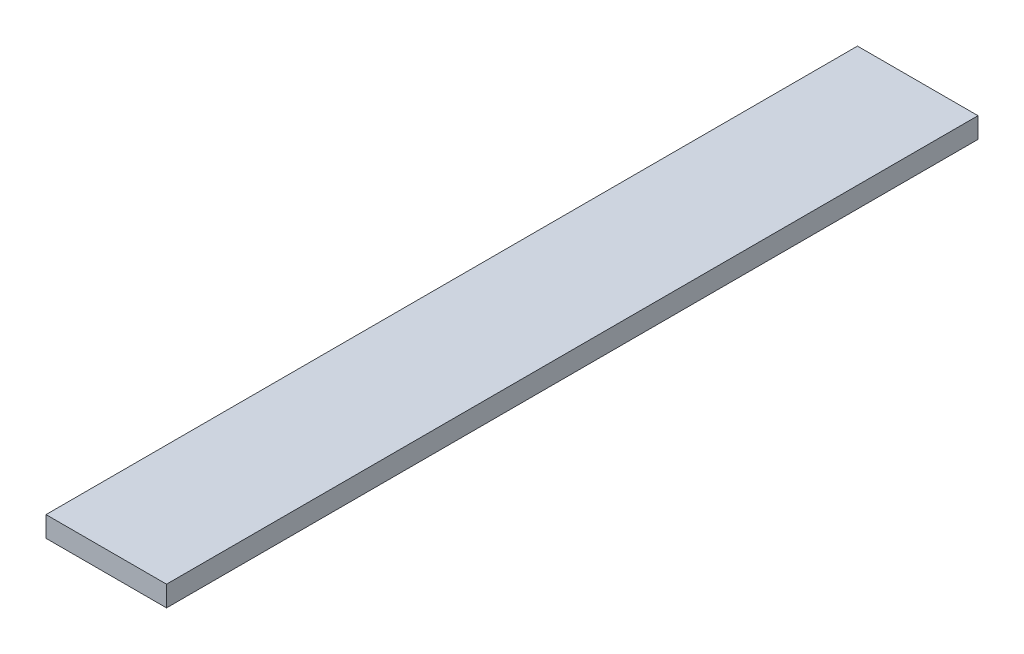
ISO-10303-21;
HEADER;
FILE_DESCRIPTION(('STEP AP214'),'2;1');
FILE_NAME('part.step','',(''),(''),'','','');
FILE_SCHEMA(('AUTOMOTIVE_DESIGN { 1 0 10303 214 1 1 1 1 }'));
ENDSEC;
DATA;
#1=APPLICATION_CONTEXT('core data for automotive mechanical design processes');
#2=APPLICATION_PROTOCOL_DEFINITION('international standard','automotive_design',2000,#1);
#3=PRODUCT_CONTEXT('',#1,'mechanical');
#4=PRODUCT('Part','Part','',(#3));
#5=PRODUCT_RELATED_PRODUCT_CATEGORY('part','',(#4));
#6=PRODUCT_DEFINITION_FORMATION('','',#4);
#7=PRODUCT_DEFINITION_CONTEXT('part definition',#1,'design');
#8=PRODUCT_DEFINITION('design','',#6,#7);
#9=PRODUCT_DEFINITION_SHAPE('','',#8);
#10=(LENGTH_UNIT() NAMED_UNIT(*) SI_UNIT(.MILLI.,.METRE.));
#11=(NAMED_UNIT(*) PLANE_ANGLE_UNIT() SI_UNIT($,.RADIAN.));
#12=(NAMED_UNIT(*) SI_UNIT($,.STERADIAN.) SOLID_ANGLE_UNIT());
#13=UNCERTAINTY_MEASURE_WITH_UNIT(LENGTH_MEASURE(1.E-05),#10,'distance_accuracy_value','');
#14=(GEOMETRIC_REPRESENTATION_CONTEXT(3) GLOBAL_UNCERTAINTY_ASSIGNED_CONTEXT((#13)) GLOBAL_UNIT_ASSIGNED_CONTEXT((#10,
#11,#12)) REPRESENTATION_CONTEXT('',''));
#15=CARTESIAN_POINT('',(0.,0.,0.));
#16=DIRECTION('',(0.,0.,1.));
#17=DIRECTION('',(1.,0.,0.));
#18=AXIS2_PLACEMENT_3D('',#15,#16,#17);
#19=CARTESIAN_POINT('',(-47.9,8.175,645.));
#20=DIRECTION('',(1.,0.,0.));
#21=DIRECTION('',(0.,0.,-1.));
#22=AXIS2_PLACEMENT_3D('',#19,#20,#21);
#23=PLANE('',#22);
#24=DIRECTION('',(0.,-1.,0.));
#25=VECTOR('',#24,1.);
#26=CARTESIAN_POINT('',(-47.9,8.175,0.));
#27=LINE('',#26,#25);
#28=CARTESIAN_POINT('',(-47.9,8.175,0.));
#29=VERTEX_POINT('',#28);
#30=CARTESIAN_POINT('',(-47.9,-8.175,0.));
#31=VERTEX_POINT('',#30);
#32=EDGE_CURVE('E106',#29,#31,#27,.T.);
#33=ORIENTED_EDGE('',*,*,#32,.T.);
#34=DIRECTION('',(0.,0.,-1.));
#35=VECTOR('',#34,1.);
#36=CARTESIAN_POINT('',(-47.9,-8.175,645.));
#37=LINE('',#36,#35);
#38=CARTESIAN_POINT('',(-47.9,-8.175,645.));
#39=VERTEX_POINT('',#38);
#40=EDGE_CURVE('E11',#39,#31,#37,.T.);
#41=ORIENTED_EDGE('',*,*,#40,.F.);
#42=DIRECTION('',(0.,-1.,0.));
#43=VECTOR('',#42,1.);
#44=CARTESIAN_POINT('',(-47.9,8.175,645.));
#45=LINE('',#44,#43);
#46=CARTESIAN_POINT('',(-47.9,8.175,645.));
#47=VERTEX_POINT('',#46);
#48=EDGE_CURVE('E94',#47,#39,#45,.T.);
#49=ORIENTED_EDGE('',*,*,#48,.F.);
#50=DIRECTION('',(0.,0.,-1.));
#51=VECTOR('',#50,1.);
#52=CARTESIAN_POINT('',(-47.9,8.175,645.));
#53=LINE('',#52,#51);
#54=EDGE_CURVE('E102',#47,#29,#53,.T.);
#55=ORIENTED_EDGE('',*,*,#54,.T.);
#56=EDGE_LOOP('',(#33,#41,#49,#55));
#57=FACE_BOUND('',#56,.T.);
#58=ADVANCED_FACE('F43',(#57),#23,.F.);
#59=CARTESIAN_POINT('',(47.9,-8.17499999999999,645.));
#60=DIRECTION('',(0.,1.,0.));
#61=DIRECTION('',(-1.,0.,0.));
#62=AXIS2_PLACEMENT_3D('',#59,#60,#61);
#63=PLANE('',#62);
#64=DIRECTION('',(1.,0.,0.));
#65=VECTOR('',#64,1.);
#66=CARTESIAN_POINT('',(47.9,-8.17499999999999,0.));
#67=LINE('',#66,#65);
#68=CARTESIAN_POINT('',(47.9,-8.17499999999999,0.));
#69=VERTEX_POINT('',#68);
#70=EDGE_CURVE('E98',#31,#69,#67,.T.);
#71=ORIENTED_EDGE('',*,*,#70,.T.);
#72=DIRECTION('',(0.,0.,-1.));
#73=VECTOR('',#72,1.);
#74=CARTESIAN_POINT('',(47.9,-8.17499999999999,645.));
#75=LINE('',#74,#73);
#76=CARTESIAN_POINT('',(47.9,-8.17499999999999,645.));
#77=VERTEX_POINT('',#76);
#78=EDGE_CURVE('E51',#77,#69,#75,.T.);
#79=ORIENTED_EDGE('',*,*,#78,.F.);
#80=DIRECTION('',(1.,0.,0.));
#81=VECTOR('',#80,1.);
#82=CARTESIAN_POINT('',(47.9,-8.17499999999999,645.));
#83=LINE('',#82,#81);
#84=EDGE_CURVE('E89',#39,#77,#83,.T.);
#85=ORIENTED_EDGE('',*,*,#84,.F.);
#86=ORIENTED_EDGE('',*,*,#40,.T.);
#87=EDGE_LOOP('',(#71,#79,#85,#86));
#88=FACE_BOUND('',#87,.T.);
#89=ADVANCED_FACE('F97',(#88),#63,.F.);
#90=CARTESIAN_POINT('',(47.9,8.17500000000001,645.));
#91=DIRECTION('',(-1.,0.,0.));
#92=DIRECTION('',(0.,0.,1.));
#93=AXIS2_PLACEMENT_3D('',#90,#91,#92);
#94=PLANE('',#93);
#95=DIRECTION('',(0.,1.,0.));
#96=VECTOR('',#95,1.);
#97=CARTESIAN_POINT('',(47.9,8.17500000000001,0.));
#98=LINE('',#97,#96);
#99=CARTESIAN_POINT('',(47.9,8.17500000000001,0.));
#100=VERTEX_POINT('',#99);
#101=EDGE_CURVE('E76',#69,#100,#98,.T.);
#102=ORIENTED_EDGE('',*,*,#101,.T.);
#103=DIRECTION('',(0.,0.,-1.));
#104=VECTOR('',#103,1.);
#105=CARTESIAN_POINT('',(47.9,8.17500000000001,645.));
#106=LINE('',#105,#104);
#107=CARTESIAN_POINT('',(47.9,8.17500000000001,645.));
#108=VERTEX_POINT('',#107);
#109=EDGE_CURVE('E99',#108,#100,#106,.T.);
#110=ORIENTED_EDGE('',*,*,#109,.F.);
#111=DIRECTION('',(0.,1.,0.));
#112=VECTOR('',#111,1.);
#113=CARTESIAN_POINT('',(47.9,8.17500000000001,645.));
#114=LINE('',#113,#112);
#115=EDGE_CURVE('E92',#77,#108,#114,.T.);
#116=ORIENTED_EDGE('',*,*,#115,.F.);
#117=ORIENTED_EDGE('',*,*,#78,.T.);
#118=EDGE_LOOP('',(#102,#110,#116,#117));
#119=FACE_BOUND('',#118,.T.);
#120=ADVANCED_FACE('F100',(#119),#94,.F.);
#121=CARTESIAN_POINT('',(47.9,8.17500000000001,645.));
#122=DIRECTION('',(0.,-1.,0.));
#123=DIRECTION('',(1.,0.,0.));
#124=AXIS2_PLACEMENT_3D('',#121,#122,#123);
#125=PLANE('',#124);
#126=DIRECTION('',(-1.,0.,0.));
#127=VECTOR('',#126,1.);
#128=CARTESIAN_POINT('',(47.9,8.17500000000001,0.));
#129=LINE('',#128,#127);
#130=EDGE_CURVE('E82',#100,#29,#129,.T.);
#131=ORIENTED_EDGE('',*,*,#130,.T.);
#132=ORIENTED_EDGE('',*,*,#54,.F.);
#133=DIRECTION('',(-1.,0.,0.));
#134=VECTOR('',#133,1.);
#135=CARTESIAN_POINT('',(47.9,8.17500000000001,645.));
#136=LINE('',#135,#134);
#137=EDGE_CURVE('E59',#108,#47,#136,.T.);
#138=ORIENTED_EDGE('',*,*,#137,.F.);
#139=ORIENTED_EDGE('',*,*,#109,.T.);
#140=EDGE_LOOP('',(#131,#132,#138,#139));
#141=FACE_BOUND('',#140,.T.);
#142=ADVANCED_FACE('F113',(#141),#125,.F.);
#143=CARTESIAN_POINT('',(0.,0.,645.));
#144=DIRECTION('',(0.,0.,-1.));
#145=DIRECTION('',(-1.,0.,0.));
#146=AXIS2_PLACEMENT_3D('',#143,#144,#145);
#147=PLANE('',#146);
#148=ORIENTED_EDGE('',*,*,#48,.T.);
#149=ORIENTED_EDGE('',*,*,#84,.T.);
#150=ORIENTED_EDGE('',*,*,#115,.T.);
#151=ORIENTED_EDGE('',*,*,#137,.T.);
#152=EDGE_LOOP('',(#148,#149,#150,#151));
#153=FACE_BOUND('',#152,.T.);
#154=ADVANCED_FACE('F90',(#153),#147,.F.);
#155=CARTESIAN_POINT('',(0.,0.,0.));
#156=DIRECTION('',(0.,0.,-1.));
#157=DIRECTION('',(-1.,0.,0.));
#158=AXIS2_PLACEMENT_3D('',#155,#156,#157);
#159=PLANE('',#158);
#160=ORIENTED_EDGE('',*,*,#32,.F.);
#161=ORIENTED_EDGE('',*,*,#130,.F.);
#162=ORIENTED_EDGE('',*,*,#101,.F.);
#163=ORIENTED_EDGE('',*,*,#70,.F.);
#164=EDGE_LOOP('',(#160,#161,#162,#163));
#165=FACE_BOUND('',#164,.T.);
#166=ADVANCED_FACE('F116',(#165),#159,.T.);
#167=CLOSED_SHELL('',(#58,#89,#120,#142,#154,#166));
#168=MANIFOLD_SOLID_BREP('B2',#167);
#169=ADVANCED_BREP_SHAPE_REPRESENTATION('',(#18,#168),#14);
#170=SHAPE_DEFINITION_REPRESENTATION(#9,#169);
ENDSEC;
END-ISO-10303-21;
